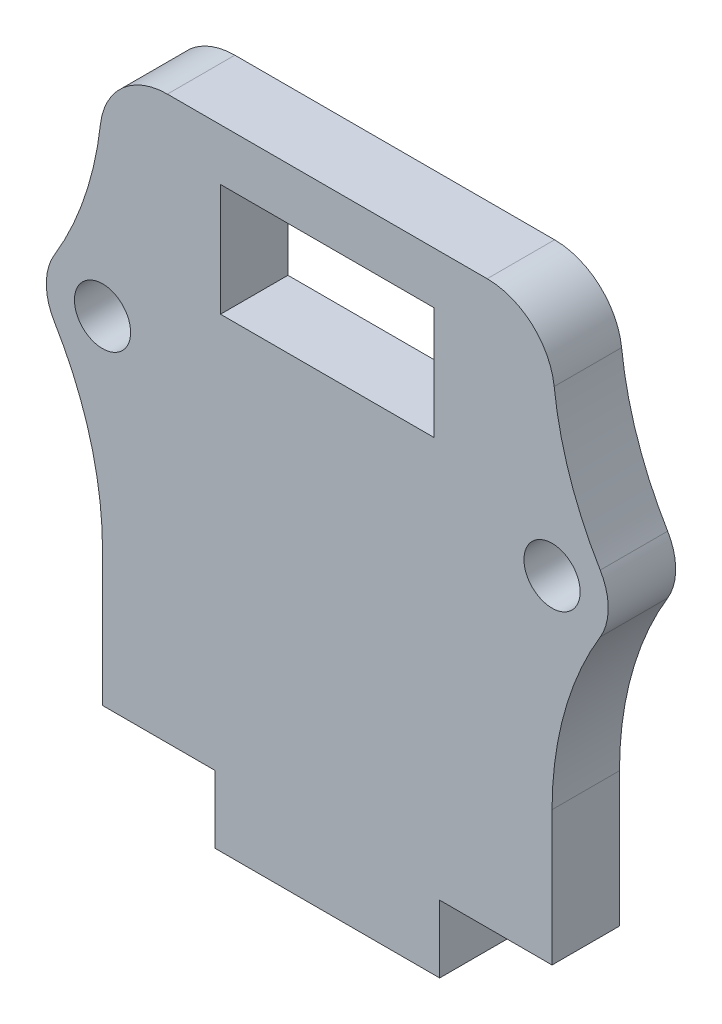
ISO-10303-21;
HEADER;
FILE_DESCRIPTION(('STEP AP214'),'2;1');
FILE_NAME('part.step','',(''),(''),'','','');
FILE_SCHEMA(('AUTOMOTIVE_DESIGN { 1 0 10303 214 1 1 1 1 }'));
ENDSEC;
DATA;
#1=APPLICATION_CONTEXT('core data for automotive mechanical design processes');
#2=APPLICATION_PROTOCOL_DEFINITION('international standard','automotive_design',2000,#1);
#3=PRODUCT_CONTEXT('',#1,'mechanical');
#4=PRODUCT('Part','Part','',(#3));
#5=PRODUCT_RELATED_PRODUCT_CATEGORY('part','',(#4));
#6=PRODUCT_DEFINITION_FORMATION('','',#4);
#7=PRODUCT_DEFINITION_CONTEXT('part definition',#1,'design');
#8=PRODUCT_DEFINITION('design','',#6,#7);
#9=PRODUCT_DEFINITION_SHAPE('','',#8);
#10=(LENGTH_UNIT() NAMED_UNIT(*) SI_UNIT(.MILLI.,.METRE.));
#11=(NAMED_UNIT(*) PLANE_ANGLE_UNIT() SI_UNIT($,.RADIAN.));
#12=(NAMED_UNIT(*) SI_UNIT($,.STERADIAN.) SOLID_ANGLE_UNIT());
#13=UNCERTAINTY_MEASURE_WITH_UNIT(LENGTH_MEASURE(1.E-05),#10,'distance_accuracy_value','');
#14=(GEOMETRIC_REPRESENTATION_CONTEXT(3) GLOBAL_UNCERTAINTY_ASSIGNED_CONTEXT((#13)) GLOBAL_UNIT_ASSIGNED_CONTEXT((#10,
#11,#12)) REPRESENTATION_CONTEXT('',''));
#15=CARTESIAN_POINT('',(0.,0.,0.));
#16=DIRECTION('',(0.,0.,1.));
#17=DIRECTION('',(1.,0.,0.));
#18=AXIS2_PLACEMENT_3D('',#15,#16,#17);
#19=CARTESIAN_POINT('',(0.,0.,1.5));
#20=DIRECTION('',(0.,0.,-1.));
#21=DIRECTION('',(-1.,0.,0.));
#22=AXIS2_PLACEMENT_3D('',#19,#20,#21);
#23=PLANE('',#22);
#24=CARTESIAN_POINT('',(10.,4.,1.5));
#25=DIRECTION('',(0.,0.,1.));
#26=DIRECTION('',(1.,0.,0.));
#27=AXIS2_PLACEMENT_3D('',#24,#25,#26);
#28=CIRCLE('',#27,1.25);
#29=CARTESIAN_POINT('',(11.25,4.,1.5));
#30=VERTEX_POINT('',#29);
#31=EDGE_CURVE('E296',#30,#30,#28,.T.);
#32=ORIENTED_EDGE('',*,*,#31,.F.);
#33=EDGE_LOOP('',(#32));
#34=FACE_BOUND('',#33,.T.);
#35=CARTESIAN_POINT('',(-10.,4.,1.5));
#36=DIRECTION('',(0.,0.,1.));
#37=DIRECTION('',(1.,0.,0.));
#38=AXIS2_PLACEMENT_3D('',#35,#36,#37);
#39=CIRCLE('',#38,1.25);
#40=CARTESIAN_POINT('',(-8.75,4.,1.5));
#41=VERTEX_POINT('',#40);
#42=EDGE_CURVE('E304',#41,#41,#39,.T.);
#43=ORIENTED_EDGE('',*,*,#42,.F.);
#44=EDGE_LOOP('',(#43));
#45=FACE_BOUND('',#44,.T.);
#46=DIRECTION('',(0.,1.,0.));
#47=VECTOR('',#46,1.);
#48=CARTESIAN_POINT('',(4.75,6.69999999999999,1.5));
#49=LINE('',#48,#47);
#50=CARTESIAN_POINT('',(4.75,6.69999999999999,1.5));
#51=VERTEX_POINT('',#50);
#52=CARTESIAN_POINT('',(4.75,11.7,1.5));
#53=VERTEX_POINT('',#52);
#54=EDGE_CURVE('E253',#51,#53,#49,.T.);
#55=ORIENTED_EDGE('',*,*,#54,.F.);
#56=DIRECTION('',(1.,0.,0.));
#57=VECTOR('',#56,1.);
#58=CARTESIAN_POINT('',(-4.75,6.69999999999999,1.5));
#59=LINE('',#58,#57);
#60=CARTESIAN_POINT('',(-4.75,6.69999999999999,1.5));
#61=VERTEX_POINT('',#60);
#62=EDGE_CURVE('E264',#61,#51,#59,.T.);
#63=ORIENTED_EDGE('',*,*,#62,.F.);
#64=DIRECTION('',(0.,-1.,0.));
#65=VECTOR('',#64,1.);
#66=CARTESIAN_POINT('',(-4.75,6.69999999999999,1.5));
#67=LINE('',#66,#65);
#68=CARTESIAN_POINT('',(-4.75,11.7,1.5));
#69=VERTEX_POINT('',#68);
#70=EDGE_CURVE('E260',#69,#61,#67,.T.);
#71=ORIENTED_EDGE('',*,*,#70,.F.);
#72=DIRECTION('',(-1.,0.,0.));
#73=VECTOR('',#72,1.);
#74=CARTESIAN_POINT('',(-4.75,11.7,1.5));
#75=LINE('',#74,#73);
#76=EDGE_CURVE('E256',#53,#69,#75,.T.);
#77=ORIENTED_EDGE('',*,*,#76,.F.);
#78=EDGE_LOOP('',(#55,#63,#71,#77));
#79=FACE_BOUND('',#78,.T.);
#80=CARTESIAN_POINT('',(25.,13.01387818866,1.5));
#81=DIRECTION('',(0.,0.,-1.));
#82=DIRECTION('',(-1.,0.,0.));
#83=AXIS2_PLACEMENT_3D('',#80,#81,#82);
#84=CIRCLE('',#83,15.);
#85=CARTESIAN_POINT('',(12.1428571428571,5.28769688409428,1.5));
#86=VERTEX_POINT('',#85);
#87=CARTESIAN_POINT('',(10.0941777165664,11.3356463647767,1.5));
#88=VERTEX_POINT('',#87);
#89=EDGE_CURVE('E372',#86,#88,#84,.T.);
#90=ORIENTED_EDGE('',*,*,#89,.T.);
#91=CARTESIAN_POINT('',(7.1130132598797,11.,1.5));
#92=DIRECTION('',(0.,0.,-1.));
#93=DIRECTION('',(-1.,0.,0.));
#94=AXIS2_PLACEMENT_3D('',#91,#92,#93);
#95=CIRCLE('',#94,3.);
#96=CARTESIAN_POINT('',(7.11301325987969,14.,1.5));
#97=VERTEX_POINT('',#96);
#98=EDGE_CURVE('E396',#88,#97,#95,.F.);
#99=ORIENTED_EDGE('',*,*,#98,.T.);
#100=DIRECTION('',(-1.,0.,0.));
#101=VECTOR('',#100,1.);
#102=CARTESIAN_POINT('',(-12.5,14.,1.5));
#103=LINE('',#102,#101);
#104=CARTESIAN_POINT('',(-7.1130132598797,14.,1.5));
#105=VERTEX_POINT('',#104);
#106=EDGE_CURVE('E312',#97,#105,#103,.T.);
#107=ORIENTED_EDGE('',*,*,#106,.T.);
#108=CARTESIAN_POINT('',(-7.1130132598797,11.,1.5));
#109=DIRECTION('',(0.,0.,-1.));
#110=DIRECTION('',(-1.,0.,0.));
#111=AXIS2_PLACEMENT_3D('',#108,#109,#110);
#112=CIRCLE('',#111,3.);
#113=CARTESIAN_POINT('',(-10.0941777165664,11.3356463647767,1.5));
#114=VERTEX_POINT('',#113);
#115=EDGE_CURVE('E393',#105,#114,#112,.F.);
#116=ORIENTED_EDGE('',*,*,#115,.T.);
#117=CARTESIAN_POINT('',(-25.,13.01387818866,1.5));
#118=DIRECTION('',(0.,0.,-1.));
#119=DIRECTION('',(-1.,0.,0.));
#120=AXIS2_PLACEMENT_3D('',#117,#118,#119);
#121=CIRCLE('',#120,15.);
#122=CARTESIAN_POINT('',(-12.1428571428571,5.28769688409428,1.5));
#123=VERTEX_POINT('',#122);
#124=EDGE_CURVE('E378',#114,#123,#121,.T.);
#125=ORIENTED_EDGE('',*,*,#124,.T.);
#126=CARTESIAN_POINT('',(-10.,4.,1.5));
#127=DIRECTION('',(0.,0.,1.));
#128=DIRECTION('',(1.,0.,0.));
#129=AXIS2_PLACEMENT_3D('',#126,#127,#128);
#130=CIRCLE('',#129,2.5);
#131=CARTESIAN_POINT('',(-12.1428571428571,2.71230311590572,1.5));
#132=VERTEX_POINT('',#131);
#133=EDGE_CURVE('E208',#123,#132,#130,.T.);
#134=ORIENTED_EDGE('',*,*,#133,.T.);
#135=CARTESIAN_POINT('',(-25.,-5.01387818865997,1.5));
#136=DIRECTION('',(0.,0.,-1.));
#137=DIRECTION('',(-1.,0.,0.));
#138=AXIS2_PLACEMENT_3D('',#135,#136,#137);
#139=CIRCLE('',#138,15.);
#140=CARTESIAN_POINT('',(-10.,-5.01387818865997,1.5));
#141=VERTEX_POINT('',#140);
#142=EDGE_CURVE('E206',#132,#141,#139,.T.);
#143=ORIENTED_EDGE('',*,*,#142,.T.);
#144=DIRECTION('',(0.,1.,0.));
#145=VECTOR('',#144,1.);
#146=CARTESIAN_POINT('',(-10.,0.,1.5));
#147=LINE('',#146,#145);
#148=CARTESIAN_POINT('',(-10.,-11.,1.5));
#149=VERTEX_POINT('',#148);
#150=EDGE_CURVE('E184',#149,#141,#147,.T.);
#151=ORIENTED_EDGE('',*,*,#150,.F.);
#152=DIRECTION('',(1.,0.,0.));
#153=VECTOR('',#152,1.);
#154=CARTESIAN_POINT('',(0.,-11.,1.5));
#155=LINE('',#154,#153);
#156=CARTESIAN_POINT('',(-5.,-11.,1.5));
#157=VERTEX_POINT('',#156);
#158=EDGE_CURVE('E195',#149,#157,#155,.T.);
#159=ORIENTED_EDGE('',*,*,#158,.T.);
#160=DIRECTION('',(0.,-1.,0.));
#161=VECTOR('',#160,1.);
#162=CARTESIAN_POINT('',(-5.,0.,1.5));
#163=LINE('',#162,#161);
#164=CARTESIAN_POINT('',(-5.,-14.,1.5));
#165=VERTEX_POINT('',#164);
#166=EDGE_CURVE('E192',#157,#165,#163,.T.);
#167=ORIENTED_EDGE('',*,*,#166,.T.);
#168=DIRECTION('',(1.,0.,0.));
#169=VECTOR('',#168,1.);
#170=CARTESIAN_POINT('',(-12.5,-14.,1.5));
#171=LINE('',#170,#169);
#172=CARTESIAN_POINT('',(5.,-14.,1.5));
#173=VERTEX_POINT('',#172);
#174=EDGE_CURVE('E316',#165,#173,#171,.T.);
#175=ORIENTED_EDGE('',*,*,#174,.T.);
#176=DIRECTION('',(0.,-1.,0.));
#177=VECTOR('',#176,1.);
#178=CARTESIAN_POINT('',(5.,0.,1.5));
#179=LINE('',#178,#177);
#180=CARTESIAN_POINT('',(5.,-11.,1.5));
#181=VERTEX_POINT('',#180);
#182=EDGE_CURVE('E222',#181,#173,#179,.T.);
#183=ORIENTED_EDGE('',*,*,#182,.F.);
#184=DIRECTION('',(1.,0.,0.));
#185=VECTOR('',#184,1.);
#186=CARTESIAN_POINT('',(0.,-11.,1.5));
#187=LINE('',#186,#185);
#188=CARTESIAN_POINT('',(10.,-11.,1.5));
#189=VERTEX_POINT('',#188);
#190=EDGE_CURVE('E218',#181,#189,#187,.T.);
#191=ORIENTED_EDGE('',*,*,#190,.T.);
#192=DIRECTION('',(0.,1.,0.));
#193=VECTOR('',#192,1.);
#194=CARTESIAN_POINT('',(10.,0.,1.5));
#195=LINE('',#194,#193);
#196=CARTESIAN_POINT('',(10.,-5.01387818865997,1.5));
#197=VERTEX_POINT('',#196);
#198=EDGE_CURVE('E229',#189,#197,#195,.T.);
#199=ORIENTED_EDGE('',*,*,#198,.T.);
#200=CARTESIAN_POINT('',(25.,-5.01387818865997,1.5));
#201=DIRECTION('',(0.,0.,-1.));
#202=DIRECTION('',(-1.,0.,0.));
#203=AXIS2_PLACEMENT_3D('',#200,#201,#202);
#204=CIRCLE('',#203,15.);
#205=CARTESIAN_POINT('',(12.1428571428571,2.71230311590572,1.5));
#206=VERTEX_POINT('',#205);
#207=EDGE_CURVE('E366',#197,#206,#204,.T.);
#208=ORIENTED_EDGE('',*,*,#207,.T.);
#209=CARTESIAN_POINT('',(10.,4.,1.5));
#210=DIRECTION('',(0.,0.,1.));
#211=DIRECTION('',(1.,0.,0.));
#212=AXIS2_PLACEMENT_3D('',#209,#210,#211);
#213=CIRCLE('',#212,2.5);
#214=EDGE_CURVE('E225',#206,#86,#213,.T.);
#215=ORIENTED_EDGE('',*,*,#214,.T.);
#216=EDGE_LOOP('',(#90,#99,#107,#116,#125,#134,#143,#151,#159,#167,#175,#183,#191,#199,#208,#215));
#217=FACE_BOUND('',#216,.T.);
#218=ADVANCED_FACE('F41',(#34,#45,#79,#217),#23,.F.);
#219=CARTESIAN_POINT('',(0.,0.,-1.5));
#220=DIRECTION('',(0.,0.,-1.));
#221=DIRECTION('',(-1.,0.,0.));
#222=AXIS2_PLACEMENT_3D('',#219,#220,#221);
#223=PLANE('',#222);
#224=CARTESIAN_POINT('',(-10.,4.,-1.5));
#225=DIRECTION('',(0.,0.,1.));
#226=DIRECTION('',(1.,0.,0.));
#227=AXIS2_PLACEMENT_3D('',#224,#225,#226);
#228=CIRCLE('',#227,1.25);
#229=CARTESIAN_POINT('',(-8.75,4.,-1.5));
#230=VERTEX_POINT('',#229);
#231=EDGE_CURVE('E300',#230,#230,#228,.T.);
#232=ORIENTED_EDGE('',*,*,#231,.T.);
#233=EDGE_LOOP('',(#232));
#234=FACE_BOUND('',#233,.T.);
#235=CARTESIAN_POINT('',(10.,4.,-1.5));
#236=DIRECTION('',(0.,0.,1.));
#237=DIRECTION('',(1.,0.,0.));
#238=AXIS2_PLACEMENT_3D('',#235,#236,#237);
#239=CIRCLE('',#238,1.25);
#240=CARTESIAN_POINT('',(11.25,4.,-1.5));
#241=VERTEX_POINT('',#240);
#242=EDGE_CURVE('E295',#241,#241,#239,.T.);
#243=ORIENTED_EDGE('',*,*,#242,.T.);
#244=EDGE_LOOP('',(#243));
#245=FACE_BOUND('',#244,.T.);
#246=DIRECTION('',(1.,0.,0.));
#247=VECTOR('',#246,1.);
#248=CARTESIAN_POINT('',(-4.75,6.69999999999999,-1.5));
#249=LINE('',#248,#247);
#250=CARTESIAN_POINT('',(-4.75,6.69999999999999,-1.5));
#251=VERTEX_POINT('',#250);
#252=CARTESIAN_POINT('',(4.75,6.69999999999999,-1.5));
#253=VERTEX_POINT('',#252);
#254=EDGE_CURVE('E257',#251,#253,#249,.T.);
#255=ORIENTED_EDGE('',*,*,#254,.T.);
#256=DIRECTION('',(0.,1.,0.));
#257=VECTOR('',#256,1.);
#258=CARTESIAN_POINT('',(4.75,6.69999999999999,-1.5));
#259=LINE('',#258,#257);
#260=CARTESIAN_POINT('',(4.75,11.7,-1.5));
#261=VERTEX_POINT('',#260);
#262=EDGE_CURVE('E252',#253,#261,#259,.T.);
#263=ORIENTED_EDGE('',*,*,#262,.T.);
#264=DIRECTION('',(-1.,0.,0.));
#265=VECTOR('',#264,1.);
#266=CARTESIAN_POINT('',(-4.75,11.7,-1.5));
#267=LINE('',#266,#265);
#268=CARTESIAN_POINT('',(-4.75,11.7,-1.5));
#269=VERTEX_POINT('',#268);
#270=EDGE_CURVE('E271',#261,#269,#267,.T.);
#271=ORIENTED_EDGE('',*,*,#270,.T.);
#272=DIRECTION('',(0.,-1.,0.));
#273=VECTOR('',#272,1.);
#274=CARTESIAN_POINT('',(-4.75,6.69999999999999,-1.5));
#275=LINE('',#274,#273);
#276=EDGE_CURVE('E275',#269,#251,#275,.T.);
#277=ORIENTED_EDGE('',*,*,#276,.T.);
#278=EDGE_LOOP('',(#255,#263,#271,#277));
#279=FACE_BOUND('',#278,.T.);
#280=DIRECTION('',(-1.,0.,0.));
#281=VECTOR('',#280,1.);
#282=CARTESIAN_POINT('',(-12.5,14.,-1.5));
#283=LINE('',#282,#281);
#284=CARTESIAN_POINT('',(7.11301325987969,14.,-1.5));
#285=VERTEX_POINT('',#284);
#286=CARTESIAN_POINT('',(-7.1130132598797,14.,-1.5));
#287=VERTEX_POINT('',#286);
#288=EDGE_CURVE('E308',#285,#287,#283,.T.);
#289=ORIENTED_EDGE('',*,*,#288,.F.);
#290=CARTESIAN_POINT('',(7.1130132598797,11.,-1.5));
#291=DIRECTION('',(0.,0.,-1.));
#292=DIRECTION('',(-1.,0.,0.));
#293=AXIS2_PLACEMENT_3D('',#290,#291,#292);
#294=CIRCLE('',#293,3.);
#295=CARTESIAN_POINT('',(10.0941777165664,11.3356463647767,-1.5));
#296=VERTEX_POINT('',#295);
#297=EDGE_CURVE('E50',#285,#296,#294,.T.);
#298=ORIENTED_EDGE('',*,*,#297,.T.);
#299=CARTESIAN_POINT('',(25.,13.01387818866,-1.5));
#300=DIRECTION('',(0.,0.,-1.));
#301=DIRECTION('',(-1.,0.,0.));
#302=AXIS2_PLACEMENT_3D('',#299,#300,#301);
#303=CIRCLE('',#302,15.);
#304=CARTESIAN_POINT('',(12.1428571428571,5.28769688409428,-1.5));
#305=VERTEX_POINT('',#304);
#306=EDGE_CURVE('E375',#296,#305,#303,.F.);
#307=ORIENTED_EDGE('',*,*,#306,.T.);
#308=CARTESIAN_POINT('',(10.,4.,-1.5));
#309=DIRECTION('',(0.,0.,-1.));
#310=DIRECTION('',(-1.,0.,0.));
#311=AXIS2_PLACEMENT_3D('',#308,#309,#310);
#312=CIRCLE('',#311,2.5);
#313=CARTESIAN_POINT('',(12.1428571428571,2.71230311590572,-1.5));
#314=VERTEX_POINT('',#313);
#315=EDGE_CURVE('E248',#305,#314,#312,.T.);
#316=ORIENTED_EDGE('',*,*,#315,.T.);
#317=CARTESIAN_POINT('',(25.,-5.01387818865997,-1.5));
#318=DIRECTION('',(0.,0.,-1.));
#319=DIRECTION('',(-1.,0.,0.));
#320=AXIS2_PLACEMENT_3D('',#317,#318,#319);
#321=CIRCLE('',#320,15.);
#322=CARTESIAN_POINT('',(10.,-5.01387818865997,-1.5));
#323=VERTEX_POINT('',#322);
#324=EDGE_CURVE('E369',#314,#323,#321,.F.);
#325=ORIENTED_EDGE('',*,*,#324,.T.);
#326=DIRECTION('',(0.,-1.,0.));
#327=VECTOR('',#326,1.);
#328=CARTESIAN_POINT('',(10.,0.,-1.5));
#329=LINE('',#328,#327);
#330=CARTESIAN_POINT('',(10.,-11.,-1.5));
#331=VERTEX_POINT('',#330);
#332=EDGE_CURVE('E337',#323,#331,#329,.T.);
#333=ORIENTED_EDGE('',*,*,#332,.T.);
#334=DIRECTION('',(-1.,0.,0.));
#335=VECTOR('',#334,1.);
#336=CARTESIAN_POINT('',(0.,-11.,-1.5));
#337=LINE('',#336,#335);
#338=CARTESIAN_POINT('',(5.,-11.,-1.5));
#339=VERTEX_POINT('',#338);
#340=EDGE_CURVE('E333',#331,#339,#337,.T.);
#341=ORIENTED_EDGE('',*,*,#340,.T.);
#342=DIRECTION('',(0.,1.,0.));
#343=VECTOR('',#342,1.);
#344=CARTESIAN_POINT('',(5.,0.,-1.5));
#345=LINE('',#344,#343);
#346=CARTESIAN_POINT('',(5.,-14.,-1.5));
#347=VERTEX_POINT('',#346);
#348=EDGE_CURVE('E216',#347,#339,#345,.T.);
#349=ORIENTED_EDGE('',*,*,#348,.F.);
#350=DIRECTION('',(1.,0.,0.));
#351=VECTOR('',#350,1.);
#352=CARTESIAN_POINT('',(-12.5,-14.,-1.5));
#353=LINE('',#352,#351);
#354=CARTESIAN_POINT('',(-5.,-14.,-1.5));
#355=VERTEX_POINT('',#354);
#356=EDGE_CURVE('E317',#355,#347,#353,.T.);
#357=ORIENTED_EDGE('',*,*,#356,.F.);
#358=DIRECTION('',(0.,1.,0.));
#359=VECTOR('',#358,1.);
#360=CARTESIAN_POINT('',(-5.,0.,-1.5));
#361=LINE('',#360,#359);
#362=CARTESIAN_POINT('',(-5.,-11.,-1.5));
#363=VERTEX_POINT('',#362);
#364=EDGE_CURVE('E240',#355,#363,#361,.T.);
#365=ORIENTED_EDGE('',*,*,#364,.T.);
#366=DIRECTION('',(-1.,0.,0.));
#367=VECTOR('',#366,1.);
#368=CARTESIAN_POINT('',(0.,-11.,-1.5));
#369=LINE('',#368,#367);
#370=CARTESIAN_POINT('',(-10.,-11.,-1.5));
#371=VERTEX_POINT('',#370);
#372=EDGE_CURVE('E342',#363,#371,#369,.T.);
#373=ORIENTED_EDGE('',*,*,#372,.T.);
#374=DIRECTION('',(0.,-1.,0.));
#375=VECTOR('',#374,1.);
#376=CARTESIAN_POINT('',(-10.,0.,-1.5));
#377=LINE('',#376,#375);
#378=CARTESIAN_POINT('',(-10.,-5.01387818865997,-1.5));
#379=VERTEX_POINT('',#378);
#380=EDGE_CURVE('E187',#379,#371,#377,.T.);
#381=ORIENTED_EDGE('',*,*,#380,.F.);
#382=CARTESIAN_POINT('',(-25.,-5.01387818865997,-1.5));
#383=DIRECTION('',(0.,0.,-1.));
#384=DIRECTION('',(-1.,0.,0.));
#385=AXIS2_PLACEMENT_3D('',#382,#383,#384);
#386=CIRCLE('',#385,15.);
#387=CARTESIAN_POINT('',(-12.1428571428571,2.71230311590572,-1.5));
#388=VERTEX_POINT('',#387);
#389=EDGE_CURVE('E386',#379,#388,#386,.F.);
#390=ORIENTED_EDGE('',*,*,#389,.T.);
#391=CARTESIAN_POINT('',(-10.,4.,-1.5));
#392=DIRECTION('',(0.,0.,-1.));
#393=DIRECTION('',(-1.,0.,0.));
#394=AXIS2_PLACEMENT_3D('',#391,#392,#393);
#395=CIRCLE('',#394,2.5);
#396=CARTESIAN_POINT('',(-12.1428571428571,5.28769688409428,-1.5));
#397=VERTEX_POINT('',#396);
#398=EDGE_CURVE('E244',#388,#397,#395,.T.);
#399=ORIENTED_EDGE('',*,*,#398,.T.);
#400=CARTESIAN_POINT('',(-25.,13.01387818866,-1.5));
#401=DIRECTION('',(0.,0.,-1.));
#402=DIRECTION('',(-1.,0.,0.));
#403=AXIS2_PLACEMENT_3D('',#400,#401,#402);
#404=CIRCLE('',#403,15.);
#405=CARTESIAN_POINT('',(-10.0941777165664,11.3356463647767,-1.5));
#406=VERTEX_POINT('',#405);
#407=EDGE_CURVE('E381',#397,#406,#404,.F.);
#408=ORIENTED_EDGE('',*,*,#407,.T.);
#409=CARTESIAN_POINT('',(-7.1130132598797,11.,-1.5));
#410=DIRECTION('',(0.,0.,-1.));
#411=DIRECTION('',(-1.,0.,0.));
#412=AXIS2_PLACEMENT_3D('',#409,#410,#411);
#413=CIRCLE('',#412,3.);
#414=EDGE_CURVE('E62',#406,#287,#413,.T.);
#415=ORIENTED_EDGE('',*,*,#414,.T.);
#416=EDGE_LOOP('',(#289,#298,#307,#316,#325,#333,#341,#349,#357,#365,#373,#381,#390,#399,#408,#415));
#417=FACE_BOUND('',#416,.T.);
#418=ADVANCED_FACE('F410',(#234,#245,#279,#417),#223,.T.);
#419=CARTESIAN_POINT('',(-12.5,14.,1.5));
#420=DIRECTION('',(0.,-1.,0.));
#421=DIRECTION('',(0.,0.,-1.));
#422=AXIS2_PLACEMENT_3D('',#419,#420,#421);
#423=PLANE('',#422);
#424=ORIENTED_EDGE('',*,*,#106,.F.);
#425=DIRECTION('',(0.,0.,1.));
#426=VECTOR('',#425,1.);
#427=CARTESIAN_POINT('',(7.11301325987969,14.,1.5));
#428=LINE('',#427,#426);
#429=EDGE_CURVE('E403',#97,#285,#428,.F.);
#430=ORIENTED_EDGE('',*,*,#429,.T.);
#431=ORIENTED_EDGE('',*,*,#288,.T.);
#432=DIRECTION('',(0.,0.,1.));
#433=VECTOR('',#432,1.);
#434=CARTESIAN_POINT('',(-7.1130132598797,14.,1.5));
#435=LINE('',#434,#433);
#436=EDGE_CURVE('E399',#287,#105,#435,.T.);
#437=ORIENTED_EDGE('',*,*,#436,.T.);
#438=EDGE_LOOP('',(#424,#430,#431,#437));
#439=FACE_BOUND('',#438,.T.);
#440=ADVANCED_FACE('F421',(#439),#423,.F.);
#441=CARTESIAN_POINT('',(-12.5,-14.,1.5));
#442=DIRECTION('',(0.,1.,0.));
#443=DIRECTION('',(0.,0.,1.));
#444=AXIS2_PLACEMENT_3D('',#441,#442,#443);
#445=PLANE('',#444);
#446=DIRECTION('',(0.,0.,1.));
#447=VECTOR('',#446,1.);
#448=CARTESIAN_POINT('',(-5.,-14.,1.5));
#449=LINE('',#448,#447);
#450=EDGE_CURVE('E330',#355,#165,#449,.T.);
#451=ORIENTED_EDGE('',*,*,#450,.F.);
#452=ORIENTED_EDGE('',*,*,#356,.T.);
#453=DIRECTION('',(0.,0.,1.));
#454=VECTOR('',#453,1.);
#455=CARTESIAN_POINT('',(5.,-14.,1.5));
#456=LINE('',#455,#454);
#457=EDGE_CURVE('E321',#347,#173,#456,.T.);
#458=ORIENTED_EDGE('',*,*,#457,.T.);
#459=ORIENTED_EDGE('',*,*,#174,.F.);
#460=EDGE_LOOP('',(#451,#452,#458,#459));
#461=FACE_BOUND('',#460,.T.);
#462=ADVANCED_FACE('F455',(#461),#445,.F.);
#463=CARTESIAN_POINT('',(-10.,4.,1.5));
#464=DIRECTION('',(0.,0.,-1.));
#465=DIRECTION('',(-1.,0.,0.));
#466=AXIS2_PLACEMENT_3D('',#463,#464,#465);
#467=CYLINDRICAL_SURFACE('',#466,1.25);
#468=ORIENTED_EDGE('',*,*,#42,.T.);
#469=EDGE_LOOP('',(#468));
#470=FACE_BOUND('',#469,.T.);
#471=ORIENTED_EDGE('',*,*,#231,.F.);
#472=EDGE_LOOP('',(#471));
#473=FACE_BOUND('',#472,.T.);
#474=ADVANCED_FACE('F452',(#470,#473),#467,.F.);
#475=CARTESIAN_POINT('',(10.,4.,1.5));
#476=DIRECTION('',(0.,0.,-1.));
#477=DIRECTION('',(-1.,0.,0.));
#478=AXIS2_PLACEMENT_3D('',#475,#476,#477);
#479=CYLINDRICAL_SURFACE('',#478,1.25);
#480=ORIENTED_EDGE('',*,*,#31,.T.);
#481=EDGE_LOOP('',(#480));
#482=FACE_BOUND('',#481,.T.);
#483=ORIENTED_EDGE('',*,*,#242,.F.);
#484=EDGE_LOOP('',(#483));
#485=FACE_BOUND('',#484,.T.);
#486=ADVANCED_FACE('F634',(#482,#485),#479,.F.);
#487=CARTESIAN_POINT('',(4.75,6.69999999999999,1.5));
#488=DIRECTION('',(-1.,0.,0.));
#489=DIRECTION('',(0.,0.,1.));
#490=AXIS2_PLACEMENT_3D('',#487,#488,#489);
#491=PLANE('',#490);
#492=ORIENTED_EDGE('',*,*,#262,.F.);
#493=DIRECTION('',(0.,0.,-1.));
#494=VECTOR('',#493,1.);
#495=CARTESIAN_POINT('',(4.75,6.69999999999999,1.5));
#496=LINE('',#495,#494);
#497=EDGE_CURVE('E267',#51,#253,#496,.T.);
#498=ORIENTED_EDGE('',*,*,#497,.F.);
#499=ORIENTED_EDGE('',*,*,#54,.T.);
#500=DIRECTION('',(0.,0.,-1.));
#501=VECTOR('',#500,1.);
#502=CARTESIAN_POINT('',(4.75,11.7,1.5));
#503=LINE('',#502,#501);
#504=EDGE_CURVE('E291',#53,#261,#503,.T.);
#505=ORIENTED_EDGE('',*,*,#504,.T.);
#506=EDGE_LOOP('',(#492,#498,#499,#505));
#507=FACE_BOUND('',#506,.T.);
#508=ADVANCED_FACE('F624',(#507),#491,.T.);
#509=CARTESIAN_POINT('',(-4.75,11.7,1.5));
#510=DIRECTION('',(0.,-1.,0.));
#511=DIRECTION('',(0.,0.,-1.));
#512=AXIS2_PLACEMENT_3D('',#509,#510,#511);
#513=PLANE('',#512);
#514=ORIENTED_EDGE('',*,*,#270,.F.);
#515=ORIENTED_EDGE('',*,*,#504,.F.);
#516=ORIENTED_EDGE('',*,*,#76,.T.);
#517=DIRECTION('',(0.,0.,-1.));
#518=VECTOR('',#517,1.);
#519=CARTESIAN_POINT('',(-4.75,11.7,1.5));
#520=LINE('',#519,#518);
#521=EDGE_CURVE('E288',#69,#269,#520,.T.);
#522=ORIENTED_EDGE('',*,*,#521,.T.);
#523=EDGE_LOOP('',(#514,#515,#516,#522));
#524=FACE_BOUND('',#523,.T.);
#525=ADVANCED_FACE('F614',(#524),#513,.T.);
#526=CARTESIAN_POINT('',(-4.75,6.69999999999999,1.5));
#527=DIRECTION('',(1.,0.,0.));
#528=DIRECTION('',(0.,0.,-1.));
#529=AXIS2_PLACEMENT_3D('',#526,#527,#528);
#530=PLANE('',#529);
#531=ORIENTED_EDGE('',*,*,#276,.F.);
#532=ORIENTED_EDGE('',*,*,#521,.F.);
#533=ORIENTED_EDGE('',*,*,#70,.T.);
#534=DIRECTION('',(0.,0.,-1.));
#535=VECTOR('',#534,1.);
#536=CARTESIAN_POINT('',(-4.75,6.69999999999999,1.5));
#537=LINE('',#536,#535);
#538=EDGE_CURVE('E285',#61,#251,#537,.T.);
#539=ORIENTED_EDGE('',*,*,#538,.T.);
#540=EDGE_LOOP('',(#531,#532,#533,#539));
#541=FACE_BOUND('',#540,.T.);
#542=ADVANCED_FACE('F604',(#541),#530,.T.);
#543=CARTESIAN_POINT('',(-4.75,6.69999999999999,1.5));
#544=DIRECTION('',(0.,1.,0.));
#545=DIRECTION('',(0.,0.,1.));
#546=AXIS2_PLACEMENT_3D('',#543,#544,#545);
#547=PLANE('',#546);
#548=ORIENTED_EDGE('',*,*,#254,.F.);
#549=ORIENTED_EDGE('',*,*,#538,.F.);
#550=ORIENTED_EDGE('',*,*,#62,.T.);
#551=ORIENTED_EDGE('',*,*,#497,.T.);
#552=EDGE_LOOP('',(#548,#549,#550,#551));
#553=FACE_BOUND('',#552,.T.);
#554=ADVANCED_FACE('F584',(#553),#547,.T.);
#555=CARTESIAN_POINT('',(0.,-11.,-8.5));
#556=DIRECTION('',(0.,-1.,0.));
#557=DIRECTION('',(0.,0.,-1.));
#558=AXIS2_PLACEMENT_3D('',#555,#556,#557);
#559=PLANE('',#558);
#560=DIRECTION('',(0.,0.,1.));
#561=VECTOR('',#560,1.);
#562=CARTESIAN_POINT('',(10.,-11.,-8.5));
#563=LINE('',#562,#561);
#564=EDGE_CURVE('E202',#331,#189,#563,.T.);
#565=ORIENTED_EDGE('',*,*,#564,.T.);
#566=ORIENTED_EDGE('',*,*,#190,.F.);
#567=DIRECTION('',(0.,0.,1.));
#568=VECTOR('',#567,1.);
#569=CARTESIAN_POINT('',(5.,-11.,-8.5));
#570=LINE('',#569,#568);
#571=EDGE_CURVE('E233',#339,#181,#570,.T.);
#572=ORIENTED_EDGE('',*,*,#571,.F.);
#573=ORIENTED_EDGE('',*,*,#340,.F.);
#574=EDGE_LOOP('',(#565,#566,#572,#573));
#575=FACE_BOUND('',#574,.T.);
#576=ADVANCED_FACE('F552',(#575),#559,.T.);
#577=CARTESIAN_POINT('',(10.,0.,-8.5));
#578=DIRECTION('',(1.,0.,0.));
#579=DIRECTION('',(0.,0.,-1.));
#580=AXIS2_PLACEMENT_3D('',#577,#578,#579);
#581=PLANE('',#580);
#582=ORIENTED_EDGE('',*,*,#332,.F.);
#583=DIRECTION('',(0.,0.,-1.));
#584=VECTOR('',#583,1.);
#585=CARTESIAN_POINT('',(10.,-5.01387818865997,1.5));
#586=LINE('',#585,#584);
#587=EDGE_CURVE('E345',#323,#197,#586,.F.);
#588=ORIENTED_EDGE('',*,*,#587,.T.);
#589=ORIENTED_EDGE('',*,*,#198,.F.);
#590=ORIENTED_EDGE('',*,*,#564,.F.);
#591=EDGE_LOOP('',(#582,#588,#589,#590));
#592=FACE_BOUND('',#591,.T.);
#593=ADVANCED_FACE('F539',(#592),#581,.T.);
#594=CARTESIAN_POINT('',(10.,4.,-8.5));
#595=DIRECTION('',(0.,0.,1.));
#596=DIRECTION('',(1.,0.,0.));
#597=AXIS2_PLACEMENT_3D('',#594,#595,#596);
#598=CYLINDRICAL_SURFACE('',#597,2.5);
#599=ORIENTED_EDGE('',*,*,#214,.F.);
#600=DIRECTION('',(0.,0.,1.));
#601=VECTOR('',#600,1.);
#602=CARTESIAN_POINT('',(12.1428571428571,2.71230311590572,-8.5));
#603=LINE('',#602,#601);
#604=EDGE_CURVE('E353',#206,#314,#603,.F.);
#605=ORIENTED_EDGE('',*,*,#604,.T.);
#606=ORIENTED_EDGE('',*,*,#315,.F.);
#607=DIRECTION('',(0.,0.,1.));
#608=VECTOR('',#607,1.);
#609=CARTESIAN_POINT('',(12.1428571428571,5.28769688409428,-8.5));
#610=LINE('',#609,#608);
#611=EDGE_CURVE('E349',#305,#86,#610,.T.);
#612=ORIENTED_EDGE('',*,*,#611,.T.);
#613=EDGE_LOOP('',(#599,#605,#606,#612));
#614=FACE_BOUND('',#613,.T.);
#615=ADVANCED_FACE('F532',(#614),#598,.T.);
#616=CARTESIAN_POINT('',(5.,0.,-8.5));
#617=DIRECTION('',(-1.,0.,0.));
#618=DIRECTION('',(0.,-1.,0.));
#619=AXIS2_PLACEMENT_3D('',#616,#617,#618);
#620=PLANE('',#619);
#621=ORIENTED_EDGE('',*,*,#348,.T.);
#622=ORIENTED_EDGE('',*,*,#571,.T.);
#623=ORIENTED_EDGE('',*,*,#182,.T.);
#624=ORIENTED_EDGE('',*,*,#457,.F.);
#625=EDGE_LOOP('',(#621,#622,#623,#624));
#626=FACE_BOUND('',#625,.T.);
#627=ADVANCED_FACE('F538',(#626),#620,.F.);
#628=CARTESIAN_POINT('',(0.,-11.,-8.5));
#629=DIRECTION('',(0.,-1.,0.));
#630=DIRECTION('',(0.,0.,-1.));
#631=AXIS2_PLACEMENT_3D('',#628,#629,#630);
#632=PLANE('',#631);
#633=DIRECTION('',(0.,0.,1.));
#634=VECTOR('',#633,1.);
#635=CARTESIAN_POINT('',(-5.,-11.,-8.5));
#636=LINE('',#635,#634);
#637=EDGE_CURVE('E191',#363,#157,#636,.T.);
#638=ORIENTED_EDGE('',*,*,#637,.T.);
#639=ORIENTED_EDGE('',*,*,#158,.F.);
#640=DIRECTION('',(0.,0.,1.));
#641=VECTOR('',#640,1.);
#642=CARTESIAN_POINT('',(-10.,-11.,-8.5));
#643=LINE('',#642,#641);
#644=EDGE_CURVE('E180',#371,#149,#643,.T.);
#645=ORIENTED_EDGE('',*,*,#644,.F.);
#646=ORIENTED_EDGE('',*,*,#372,.F.);
#647=EDGE_LOOP('',(#638,#639,#645,#646));
#648=FACE_BOUND('',#647,.T.);
#649=ADVANCED_FACE('F196',(#648),#632,.T.);
#650=CARTESIAN_POINT('',(-5.,0.,-8.5));
#651=DIRECTION('',(-1.,0.,0.));
#652=DIRECTION('',(0.,0.,1.));
#653=AXIS2_PLACEMENT_3D('',#650,#651,#652);
#654=PLANE('',#653);
#655=ORIENTED_EDGE('',*,*,#450,.T.);
#656=ORIENTED_EDGE('',*,*,#166,.F.);
#657=ORIENTED_EDGE('',*,*,#637,.F.);
#658=ORIENTED_EDGE('',*,*,#364,.F.);
#659=EDGE_LOOP('',(#655,#656,#657,#658));
#660=FACE_BOUND('',#659,.T.);
#661=ADVANCED_FACE('F523',(#660),#654,.T.);
#662=CARTESIAN_POINT('',(-10.,4.,-8.5));
#663=DIRECTION('',(0.,0.,1.));
#664=DIRECTION('',(1.,0.,0.));
#665=AXIS2_PLACEMENT_3D('',#662,#663,#664);
#666=CYLINDRICAL_SURFACE('',#665,2.5);
#667=ORIENTED_EDGE('',*,*,#133,.F.);
#668=DIRECTION('',(0.,0.,1.));
#669=VECTOR('',#668,1.);
#670=CARTESIAN_POINT('',(-12.1428571428571,5.28769688409428,-8.5));
#671=LINE('',#670,#669);
#672=EDGE_CURVE('E360',#123,#397,#671,.F.);
#673=ORIENTED_EDGE('',*,*,#672,.T.);
#674=ORIENTED_EDGE('',*,*,#398,.F.);
#675=DIRECTION('',(0.,0.,1.));
#676=VECTOR('',#675,1.);
#677=CARTESIAN_POINT('',(-12.1428571428571,2.71230311590571,-8.5));
#678=LINE('',#677,#676);
#679=EDGE_CURVE('E356',#388,#132,#678,.T.);
#680=ORIENTED_EDGE('',*,*,#679,.T.);
#681=EDGE_LOOP('',(#667,#673,#674,#680));
#682=FACE_BOUND('',#681,.T.);
#683=ADVANCED_FACE('F429',(#682),#666,.T.);
#684=CARTESIAN_POINT('',(-10.,0.,-8.5));
#685=DIRECTION('',(1.,0.,0.));
#686=DIRECTION('',(0.,0.,-1.));
#687=AXIS2_PLACEMENT_3D('',#684,#685,#686);
#688=PLANE('',#687);
#689=ORIENTED_EDGE('',*,*,#150,.T.);
#690=DIRECTION('',(0.,0.,1.));
#691=VECTOR('',#690,1.);
#692=CARTESIAN_POINT('',(-10.,-5.01387818865997,-8.5));
#693=LINE('',#692,#691);
#694=EDGE_CURVE('E363',#141,#379,#693,.F.);
#695=ORIENTED_EDGE('',*,*,#694,.T.);
#696=ORIENTED_EDGE('',*,*,#380,.T.);
#697=ORIENTED_EDGE('',*,*,#644,.T.);
#698=EDGE_LOOP('',(#689,#695,#696,#697));
#699=FACE_BOUND('',#698,.T.);
#700=ADVANCED_FACE('F182',(#699),#688,.F.);
#701=CARTESIAN_POINT('',(25.,-5.01387818865997,-8.5));
#702=DIRECTION('',(0.,0.,1.));
#703=DIRECTION('',(1.,0.,0.));
#704=AXIS2_PLACEMENT_3D('',#701,#702,#703);
#705=CYLINDRICAL_SURFACE('',#704,15.);
#706=ORIENTED_EDGE('',*,*,#324,.F.);
#707=ORIENTED_EDGE('',*,*,#604,.F.);
#708=ORIENTED_EDGE('',*,*,#207,.F.);
#709=ORIENTED_EDGE('',*,*,#587,.F.);
#710=EDGE_LOOP('',(#706,#707,#708,#709));
#711=FACE_BOUND('',#710,.T.);
#712=ADVANCED_FACE('F461',(#711),#705,.F.);
#713=CARTESIAN_POINT('',(25.,13.01387818866,-8.5));
#714=DIRECTION('',(0.,0.,1.));
#715=DIRECTION('',(1.,0.,0.));
#716=AXIS2_PLACEMENT_3D('',#713,#714,#715);
#717=CYLINDRICAL_SURFACE('',#716,15.);
#718=ORIENTED_EDGE('',*,*,#306,.F.);
#719=DIRECTION('',(0.,0.,1.));
#720=VECTOR('',#719,1.);
#721=CARTESIAN_POINT('',(10.0941777165664,11.3356463647767,-8.5));
#722=LINE('',#721,#720);
#723=EDGE_CURVE('E389',#296,#88,#722,.T.);
#724=ORIENTED_EDGE('',*,*,#723,.T.);
#725=ORIENTED_EDGE('',*,*,#89,.F.);
#726=ORIENTED_EDGE('',*,*,#611,.F.);
#727=EDGE_LOOP('',(#718,#724,#725,#726));
#728=FACE_BOUND('',#727,.T.);
#729=ADVANCED_FACE('F417',(#728),#717,.F.);
#730=CARTESIAN_POINT('',(-25.,13.01387818866,-8.5));
#731=DIRECTION('',(0.,0.,1.));
#732=DIRECTION('',(1.,0.,0.));
#733=AXIS2_PLACEMENT_3D('',#730,#731,#732);
#734=CYLINDRICAL_SURFACE('',#733,15.);
#735=ORIENTED_EDGE('',*,*,#124,.F.);
#736=DIRECTION('',(0.,0.,1.));
#737=VECTOR('',#736,1.);
#738=CARTESIAN_POINT('',(-10.0941777165664,11.3356463647767,-8.5));
#739=LINE('',#738,#737);
#740=EDGE_CURVE('E11',#114,#406,#739,.F.);
#741=ORIENTED_EDGE('',*,*,#740,.T.);
#742=ORIENTED_EDGE('',*,*,#407,.F.);
#743=ORIENTED_EDGE('',*,*,#672,.F.);
#744=EDGE_LOOP('',(#735,#741,#742,#743));
#745=FACE_BOUND('',#744,.T.);
#746=ADVANCED_FACE('F426',(#745),#734,.F.);
#747=CARTESIAN_POINT('',(-25.,-5.01387818865997,-8.5));
#748=DIRECTION('',(0.,0.,1.));
#749=DIRECTION('',(1.,0.,0.));
#750=AXIS2_PLACEMENT_3D('',#747,#748,#749);
#751=CYLINDRICAL_SURFACE('',#750,15.);
#752=ORIENTED_EDGE('',*,*,#389,.F.);
#753=ORIENTED_EDGE('',*,*,#694,.F.);
#754=ORIENTED_EDGE('',*,*,#142,.F.);
#755=ORIENTED_EDGE('',*,*,#679,.F.);
#756=EDGE_LOOP('',(#752,#753,#754,#755));
#757=FACE_BOUND('',#756,.T.);
#758=ADVANCED_FACE('F433',(#757),#751,.F.);
#759=CARTESIAN_POINT('',(7.1130132598797,11.,-8.5));
#760=DIRECTION('',(0.,0.,1.));
#761=DIRECTION('',(1.,0.,0.));
#762=AXIS2_PLACEMENT_3D('',#759,#760,#761);
#763=CYLINDRICAL_SURFACE('',#762,3.);
#764=ORIENTED_EDGE('',*,*,#297,.F.);
#765=ORIENTED_EDGE('',*,*,#429,.F.);
#766=ORIENTED_EDGE('',*,*,#98,.F.);
#767=ORIENTED_EDGE('',*,*,#723,.F.);
#768=EDGE_LOOP('',(#764,#765,#766,#767));
#769=FACE_BOUND('',#768,.T.);
#770=ADVANCED_FACE('F418',(#769),#763,.T.);
#771=CARTESIAN_POINT('',(-7.1130132598797,11.,-8.5));
#772=DIRECTION('',(0.,0.,1.));
#773=DIRECTION('',(1.,0.,0.));
#774=AXIS2_PLACEMENT_3D('',#771,#772,#773);
#775=CYLINDRICAL_SURFACE('',#774,3.);
#776=ORIENTED_EDGE('',*,*,#414,.F.);
#777=ORIENTED_EDGE('',*,*,#740,.F.);
#778=ORIENTED_EDGE('',*,*,#115,.F.);
#779=ORIENTED_EDGE('',*,*,#436,.F.);
#780=EDGE_LOOP('',(#776,#777,#778,#779));
#781=FACE_BOUND('',#780,.T.);
#782=ADVANCED_FACE('F43',(#781),#775,.T.);
#783=CLOSED_SHELL('',(#218,#418,#440,#462,#474,#486,#508,#525,#542,#554,#576,#593,#615,#627,
#649,#661,#683,#700,#712,#729,#746,#758,#770,#782));
#784=MANIFOLD_SOLID_BREP('B2',#783);
#785=ADVANCED_BREP_SHAPE_REPRESENTATION('',(#18,#784),#14);
#786=SHAPE_DEFINITION_REPRESENTATION(#9,#785);
ENDSEC;
END-ISO-10303-21;
